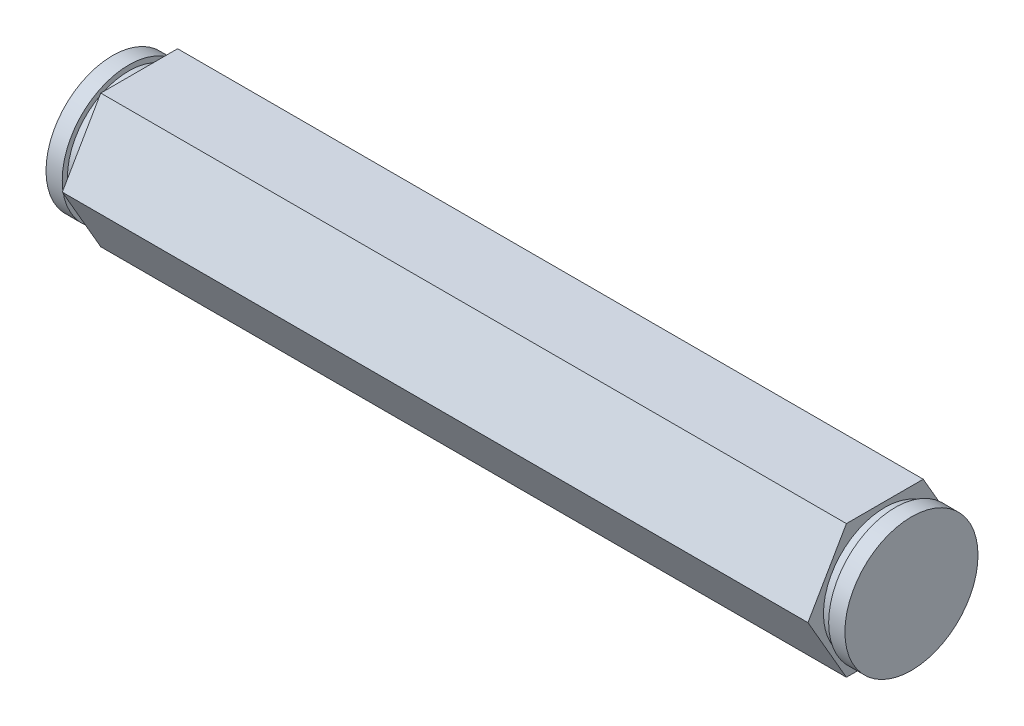
ISO-10303-21;
HEADER;
FILE_DESCRIPTION(('STEP AP214'),'2;1');
FILE_NAME('part.step','',(''),(''),'','','');
FILE_SCHEMA(('AUTOMOTIVE_DESIGN { 1 0 10303 214 1 1 1 1 }'));
ENDSEC;
DATA;
#1=APPLICATION_CONTEXT('core data for automotive mechanical design processes');
#2=APPLICATION_PROTOCOL_DEFINITION('international standard','automotive_design',2000,#1);
#3=PRODUCT_CONTEXT('',#1,'mechanical');
#4=PRODUCT('Part','Part','',(#3));
#5=PRODUCT_RELATED_PRODUCT_CATEGORY('part','',(#4));
#6=PRODUCT_DEFINITION_FORMATION('','',#4);
#7=PRODUCT_DEFINITION_CONTEXT('part definition',#1,'design');
#8=PRODUCT_DEFINITION('design','',#6,#7);
#9=PRODUCT_DEFINITION_SHAPE('','',#8);
#10=(LENGTH_UNIT() NAMED_UNIT(*) SI_UNIT(.MILLI.,.METRE.));
#11=(NAMED_UNIT(*) PLANE_ANGLE_UNIT() SI_UNIT($,.RADIAN.));
#12=(NAMED_UNIT(*) SI_UNIT($,.STERADIAN.) SOLID_ANGLE_UNIT());
#13=UNCERTAINTY_MEASURE_WITH_UNIT(LENGTH_MEASURE(1.E-05),#10,'distance_accuracy_value','');
#14=(GEOMETRIC_REPRESENTATION_CONTEXT(3) GLOBAL_UNCERTAINTY_ASSIGNED_CONTEXT((#13)) GLOBAL_UNIT_ASSIGNED_CONTEXT((#10,
#11,#12)) REPRESENTATION_CONTEXT('',''));
#15=CARTESIAN_POINT('',(0.,0.,0.));
#16=DIRECTION('',(0.,0.,1.));
#17=DIRECTION('',(1.,0.,0.));
#18=AXIS2_PLACEMENT_3D('',#15,#16,#17);
#19=CARTESIAN_POINT('',(38.11087501,-6.34999999999993,-3.66617420935418));
#20=DIRECTION('',(0.,0.499999999999995,0.866025403784441));
#21=DIRECTION('',(0.,-0.866025403784441,0.499999999999995));
#22=AXIS2_PLACEMENT_3D('',#19,#20,#21);
#23=PLANE('',#22);
#24=DIRECTION('',(-1.,0.,0.));
#25=VECTOR('',#24,1.);
#26=CARTESIAN_POINT('',(38.11087501,-6.34999999999993,-3.66617420935418));
#27=LINE('',#26,#25);
#28=CARTESIAN_POINT('',(35.57087501,-6.34999999999993,-3.66617420935418));
#29=VERTEX_POINT('',#28);
#30=CARTESIAN_POINT('',(-35.57087501,-6.34999999999993,-3.66617420935418));
#31=VERTEX_POINT('',#30);
#32=EDGE_CURVE('E114',#29,#31,#27,.T.);
#33=ORIENTED_EDGE('',*,*,#32,.T.);
#34=DIRECTION('',(0.,0.866025403784441,-0.499999999999995));
#35=VECTOR('',#34,1.);
#36=CARTESIAN_POINT('',(-35.57087501,-6.34999999999993,-3.66617420935418));
#37=LINE('',#36,#35);
#38=CARTESIAN_POINT('',(-35.57087501,0.,-7.33234841870821));
#39=VERTEX_POINT('',#38);
#40=EDGE_CURVE('E58',#31,#39,#37,.T.);
#41=ORIENTED_EDGE('',*,*,#40,.T.);
#42=DIRECTION('',(-1.,0.,0.));
#43=VECTOR('',#42,1.);
#44=CARTESIAN_POINT('',(38.11087501,0.,-7.33234841870821));
#45=LINE('',#44,#43);
#46=CARTESIAN_POINT('',(35.57087501,0.,-7.33234841870821));
#47=VERTEX_POINT('',#46);
#48=EDGE_CURVE('E131',#47,#39,#45,.T.);
#49=ORIENTED_EDGE('',*,*,#48,.F.);
#50=DIRECTION('',(0.,-0.866025403784441,0.499999999999995));
#51=VECTOR('',#50,1.);
#52=CARTESIAN_POINT('',(35.57087501,-6.34999999999993,-3.66617420935418));
#53=LINE('',#52,#51);
#54=EDGE_CURVE('E120',#47,#29,#53,.T.);
#55=ORIENTED_EDGE('',*,*,#54,.T.);
#56=EDGE_LOOP('',(#33,#41,#49,#55));
#57=FACE_BOUND('',#56,.T.);
#58=ADVANCED_FACE('F43',(#57),#23,.F.);
#59=CARTESIAN_POINT('',(38.11087501,0.,-7.33234841870821));
#60=DIRECTION('',(0.,-0.500000000000001,0.866025403784438));
#61=DIRECTION('',(0.,-0.866025403784438,-0.500000000000001));
#62=AXIS2_PLACEMENT_3D('',#59,#60,#61);
#63=PLANE('',#62);
#64=ORIENTED_EDGE('',*,*,#48,.T.);
#65=DIRECTION('',(0.,0.866025403784438,0.500000000000001));
#66=VECTOR('',#65,1.);
#67=CARTESIAN_POINT('',(-35.57087501,0.,-7.33234841870821));
#68=LINE('',#67,#66);
#69=CARTESIAN_POINT('',(-35.57087501,6.34999999999998,-3.66617420935409));
#70=VERTEX_POINT('',#69);
#71=EDGE_CURVE('E171',#39,#70,#68,.T.);
#72=ORIENTED_EDGE('',*,*,#71,.T.);
#73=DIRECTION('',(-1.,0.,0.));
#74=VECTOR('',#73,1.);
#75=CARTESIAN_POINT('',(38.11087501,6.34999999999998,-3.66617420935409));
#76=LINE('',#75,#74);
#77=CARTESIAN_POINT('',(35.57087501,6.34999999999998,-3.66617420935409));
#78=VERTEX_POINT('',#77);
#79=EDGE_CURVE('E127',#78,#70,#76,.T.);
#80=ORIENTED_EDGE('',*,*,#79,.F.);
#81=DIRECTION('',(0.,-0.866025403784438,-0.500000000000001));
#82=VECTOR('',#81,1.);
#83=CARTESIAN_POINT('',(35.57087501,0.,-7.33234841870821));
#84=LINE('',#83,#82);
#85=EDGE_CURVE('E199',#78,#47,#84,.T.);
#86=ORIENTED_EDGE('',*,*,#85,.T.);
#87=EDGE_LOOP('',(#64,#72,#80,#86));
#88=FACE_BOUND('',#87,.T.);
#89=ADVANCED_FACE('F209',(#88),#63,.F.);
#90=CARTESIAN_POINT('',(38.11087501,6.34999999999998,-3.66617420935409));
#91=DIRECTION('',(0.,-1.,0.));
#92=DIRECTION('',(0.,0.,-1.));
#93=AXIS2_PLACEMENT_3D('',#90,#91,#92);
#94=PLANE('',#93);
#95=ORIENTED_EDGE('',*,*,#79,.T.);
#96=DIRECTION('',(0.,0.,1.));
#97=VECTOR('',#96,1.);
#98=CARTESIAN_POINT('',(-35.57087501,6.34999999999998,-3.66617420935409));
#99=LINE('',#98,#97);
#100=CARTESIAN_POINT('',(-35.57087501,6.34999999999995,3.66617420935414));
#101=VERTEX_POINT('',#100);
#102=EDGE_CURVE('E167',#70,#101,#99,.T.);
#103=ORIENTED_EDGE('',*,*,#102,.T.);
#104=DIRECTION('',(-1.,0.,0.));
#105=VECTOR('',#104,1.);
#106=CARTESIAN_POINT('',(38.11087501,6.34999999999995,3.66617420935414));
#107=LINE('',#106,#105);
#108=CARTESIAN_POINT('',(35.57087501,6.34999999999995,3.66617420935414));
#109=VERTEX_POINT('',#108);
#110=EDGE_CURVE('E118',#109,#101,#107,.T.);
#111=ORIENTED_EDGE('',*,*,#110,.F.);
#112=DIRECTION('',(0.,0.,-1.));
#113=VECTOR('',#112,1.);
#114=CARTESIAN_POINT('',(35.57087501,6.34999999999998,-3.66617420935409));
#115=LINE('',#114,#113);
#116=EDGE_CURVE('E195',#109,#78,#115,.T.);
#117=ORIENTED_EDGE('',*,*,#116,.T.);
#118=EDGE_LOOP('',(#95,#103,#111,#117));
#119=FACE_BOUND('',#118,.T.);
#120=ADVANCED_FACE('F211',(#119),#94,.F.);
#121=CARTESIAN_POINT('',(38.11087501,6.34999999999995,3.66617420935414));
#122=DIRECTION('',(0.,-0.499999999999995,-0.866025403784442));
#123=DIRECTION('',(0.,0.866025403784442,-0.499999999999995));
#124=AXIS2_PLACEMENT_3D('',#121,#122,#123);
#125=PLANE('',#124);
#126=ORIENTED_EDGE('',*,*,#110,.T.);
#127=DIRECTION('',(0.,-0.866025403784442,0.499999999999995));
#128=VECTOR('',#127,1.);
#129=CARTESIAN_POINT('',(-35.57087501,6.34999999999995,3.66617420935414));
#130=LINE('',#129,#128);
#131=CARTESIAN_POINT('',(-35.57087501,0.,7.33234841870821));
#132=VERTEX_POINT('',#131);
#133=EDGE_CURVE('E108',#101,#132,#130,.T.);
#134=ORIENTED_EDGE('',*,*,#133,.T.);
#135=DIRECTION('',(-1.,0.,0.));
#136=VECTOR('',#135,1.);
#137=CARTESIAN_POINT('',(38.11087501,0.,7.33234841870821));
#138=LINE('',#137,#136);
#139=CARTESIAN_POINT('',(35.57087501,0.,7.33234841870821));
#140=VERTEX_POINT('',#139);
#141=EDGE_CURVE('E106',#140,#132,#138,.T.);
#142=ORIENTED_EDGE('',*,*,#141,.F.);
#143=DIRECTION('',(0.,0.866025403784442,-0.499999999999995));
#144=VECTOR('',#143,1.);
#145=CARTESIAN_POINT('',(35.57087501,6.34999999999995,3.66617420935414));
#146=LINE('',#145,#144);
#147=EDGE_CURVE('E191',#140,#109,#146,.T.);
#148=ORIENTED_EDGE('',*,*,#147,.T.);
#149=EDGE_LOOP('',(#126,#134,#142,#148));
#150=FACE_BOUND('',#149,.T.);
#151=ADVANCED_FACE('F214',(#150),#125,.F.);
#152=CARTESIAN_POINT('',(38.11087501,0.,7.33234841870821));
#153=DIRECTION('',(0.,0.500000000000007,-0.866025403784435));
#154=DIRECTION('',(0.,0.866025403784435,0.500000000000007));
#155=AXIS2_PLACEMENT_3D('',#152,#153,#154);
#156=PLANE('',#155);
#157=ORIENTED_EDGE('',*,*,#141,.T.);
#158=DIRECTION('',(0.,-0.866025403784435,-0.500000000000007));
#159=VECTOR('',#158,1.);
#160=CARTESIAN_POINT('',(-35.57087501,0.,7.33234841870821));
#161=LINE('',#160,#159);
#162=CARTESIAN_POINT('',(-35.57087501,-6.35,3.66617420935405));
#163=VERTEX_POINT('',#162);
#164=EDGE_CURVE('E94',#132,#163,#161,.T.);
#165=ORIENTED_EDGE('',*,*,#164,.T.);
#166=DIRECTION('',(-1.,0.,0.));
#167=VECTOR('',#166,1.);
#168=CARTESIAN_POINT('',(38.11087501,-6.35,3.66617420935405));
#169=LINE('',#168,#167);
#170=CARTESIAN_POINT('',(35.57087501,-6.35,3.66617420935405));
#171=VERTEX_POINT('',#170);
#172=EDGE_CURVE('E104',#171,#163,#169,.T.);
#173=ORIENTED_EDGE('',*,*,#172,.F.);
#174=DIRECTION('',(0.,0.866025403784435,0.500000000000007));
#175=VECTOR('',#174,1.);
#176=CARTESIAN_POINT('',(35.57087501,0.,7.33234841870821));
#177=LINE('',#176,#175);
#178=EDGE_CURVE('E65',#171,#140,#177,.T.);
#179=ORIENTED_EDGE('',*,*,#178,.T.);
#180=EDGE_LOOP('',(#157,#165,#173,#179));
#181=FACE_BOUND('',#180,.T.);
#182=ADVANCED_FACE('F103',(#181),#156,.F.);
#183=CARTESIAN_POINT('',(38.11087501,-6.35,3.66617420935405));
#184=DIRECTION('',(0.,1.,0.));
#185=DIRECTION('',(0.,0.,1.));
#186=AXIS2_PLACEMENT_3D('',#183,#184,#185);
#187=PLANE('',#186);
#188=ORIENTED_EDGE('',*,*,#172,.T.);
#189=DIRECTION('',(0.,0.,-1.));
#190=VECTOR('',#189,1.);
#191=CARTESIAN_POINT('',(-35.57087501,-6.35,3.66617420935405));
#192=LINE('',#191,#190);
#193=EDGE_CURVE('E11',#163,#31,#192,.T.);
#194=ORIENTED_EDGE('',*,*,#193,.T.);
#195=ORIENTED_EDGE('',*,*,#32,.F.);
#196=DIRECTION('',(0.,0.,1.));
#197=VECTOR('',#196,1.);
#198=CARTESIAN_POINT('',(35.57087501,-6.35,3.66617420935405));
#199=LINE('',#198,#197);
#200=EDGE_CURVE('E112',#29,#171,#199,.T.);
#201=ORIENTED_EDGE('',*,*,#200,.T.);
#202=EDGE_LOOP('',(#188,#194,#195,#201));
#203=FACE_BOUND('',#202,.T.);
#204=ADVANCED_FACE('F111',(#203),#187,.F.);
#205=CARTESIAN_POINT('',(35.57087501,0.,8.89));
#206=DIRECTION('',(-1.,0.,0.));
#207=DIRECTION('',(0.,0.,1.));
#208=AXIS2_PLACEMENT_3D('',#205,#206,#207);
#209=PLANE('',#208);
#210=CARTESIAN_POINT('',(35.57087501,0.,0.));
#211=DIRECTION('',(-1.,0.,0.));
#212=DIRECTION('',(0.,0.,1.));
#213=AXIS2_PLACEMENT_3D('',#210,#211,#212);
#214=CIRCLE('',#213,5.8547);
#215=CARTESIAN_POINT('',(35.57087501,0.,5.8547));
#216=VERTEX_POINT('',#215);
#217=EDGE_CURVE('E185',#216,#216,#214,.T.);
#218=ORIENTED_EDGE('',*,*,#217,.T.);
#219=EDGE_LOOP('',(#218));
#220=FACE_BOUND('',#219,.T.);
#221=ORIENTED_EDGE('',*,*,#85,.F.);
#222=ORIENTED_EDGE('',*,*,#116,.F.);
#223=ORIENTED_EDGE('',*,*,#147,.F.);
#224=ORIENTED_EDGE('',*,*,#178,.F.);
#225=ORIENTED_EDGE('',*,*,#200,.F.);
#226=ORIENTED_EDGE('',*,*,#54,.F.);
#227=EDGE_LOOP('',(#221,#222,#223,#224,#225,#226));
#228=FACE_BOUND('',#227,.T.);
#229=ADVANCED_FACE('F206',(#220,#228),#209,.F.);
#230=CARTESIAN_POINT('',(0.,0.,0.));
#231=DIRECTION('',(-1.,0.,0.));
#232=DIRECTION('',(0.,0.,1.));
#233=AXIS2_PLACEMENT_3D('',#230,#231,#232);
#234=CYLINDRICAL_SURFACE('',#233,6.35);
#235=CARTESIAN_POINT('',(38.11087501,0.,0.));
#236=DIRECTION('',(1.,0.,0.));
#237=DIRECTION('',(0.,0.,-1.));
#238=AXIS2_PLACEMENT_3D('',#235,#236,#237);
#239=CIRCLE('',#238,6.35);
#240=CARTESIAN_POINT('',(38.11087501,0.,-6.35));
#241=VERTEX_POINT('',#240);
#242=EDGE_CURVE('E135',#241,#241,#239,.F.);
#243=ORIENTED_EDGE('',*,*,#242,.T.);
#244=EDGE_LOOP('',(#243));
#245=FACE_BOUND('',#244,.T.);
#246=CARTESIAN_POINT('',(36.56147501,0.,0.));
#247=DIRECTION('',(-1.,0.,0.));
#248=DIRECTION('',(0.,0.,1.));
#249=AXIS2_PLACEMENT_3D('',#246,#247,#248);
#250=CIRCLE('',#249,6.35);
#251=CARTESIAN_POINT('',(36.56147501,0.,6.35));
#252=VERTEX_POINT('',#251);
#253=EDGE_CURVE('E177',#252,#252,#250,.T.);
#254=ORIENTED_EDGE('',*,*,#253,.F.);
#255=EDGE_LOOP('',(#254));
#256=FACE_BOUND('',#255,.T.);
#257=ADVANCED_FACE('F331',(#245,#256),#234,.T.);
#258=CARTESIAN_POINT('',(0.,0.,0.));
#259=DIRECTION('',(-1.,0.,0.));
#260=DIRECTION('',(0.,0.,1.));
#261=AXIS2_PLACEMENT_3D('',#258,#259,#260);
#262=CYLINDRICAL_SURFACE('',#261,5.8547);
#263=ORIENTED_EDGE('',*,*,#217,.F.);
#264=EDGE_LOOP('',(#263));
#265=FACE_BOUND('',#264,.T.);
#266=CARTESIAN_POINT('',(36.56147501,0.,0.));
#267=DIRECTION('',(-1.,0.,0.));
#268=DIRECTION('',(0.,0.,1.));
#269=AXIS2_PLACEMENT_3D('',#266,#267,#268);
#270=CIRCLE('',#269,5.8547);
#271=CARTESIAN_POINT('',(36.56147501,0.,5.8547));
#272=VERTEX_POINT('',#271);
#273=EDGE_CURVE('E181',#272,#272,#270,.T.);
#274=ORIENTED_EDGE('',*,*,#273,.T.);
#275=EDGE_LOOP('',(#274));
#276=FACE_BOUND('',#275,.T.);
#277=ADVANCED_FACE('F319',(#265,#276),#262,.T.);
#278=CARTESIAN_POINT('',(36.56147501,0.,5.8547));
#279=DIRECTION('',(1.,0.,0.));
#280=DIRECTION('',(0.,0.,-1.));
#281=AXIS2_PLACEMENT_3D('',#278,#279,#280);
#282=PLANE('',#281);
#283=ORIENTED_EDGE('',*,*,#273,.F.);
#284=EDGE_LOOP('',(#283));
#285=FACE_BOUND('',#284,.T.);
#286=ORIENTED_EDGE('',*,*,#253,.T.);
#287=EDGE_LOOP('',(#286));
#288=FACE_BOUND('',#287,.T.);
#289=ADVANCED_FACE('F313',(#285,#288),#282,.F.);
#290=CARTESIAN_POINT('',(38.11087501,0.,0.));
#291=DIRECTION('',(1.,0.,0.));
#292=DIRECTION('',(0.,0.,-1.));
#293=AXIS2_PLACEMENT_3D('',#290,#291,#292);
#294=PLANE('',#293);
#295=ORIENTED_EDGE('',*,*,#242,.F.);
#296=EDGE_LOOP('',(#295));
#297=FACE_BOUND('',#296,.T.);
#298=ADVANCED_FACE('F266',(#297),#294,.T.);
#299=CARTESIAN_POINT('',(-35.57087501,0.,8.89));
#300=DIRECTION('',(1.,0.,0.));
#301=DIRECTION('',(0.,0.,1.));
#302=AXIS2_PLACEMENT_3D('',#299,#300,#301);
#303=PLANE('',#302);
#304=CARTESIAN_POINT('',(-35.57087501,0.,0.));
#305=DIRECTION('',(-1.,0.,0.));
#306=DIRECTION('',(0.,0.,1.));
#307=AXIS2_PLACEMENT_3D('',#304,#305,#306);
#308=CIRCLE('',#307,5.8547);
#309=CARTESIAN_POINT('',(-35.57087501,0.,5.8547));
#310=VERTEX_POINT('',#309);
#311=EDGE_CURVE('E109',#310,#310,#308,.T.);
#312=ORIENTED_EDGE('',*,*,#311,.F.);
#313=EDGE_LOOP('',(#312));
#314=FACE_BOUND('',#313,.T.);
#315=ORIENTED_EDGE('',*,*,#193,.F.);
#316=ORIENTED_EDGE('',*,*,#164,.F.);
#317=ORIENTED_EDGE('',*,*,#133,.F.);
#318=ORIENTED_EDGE('',*,*,#102,.F.);
#319=ORIENTED_EDGE('',*,*,#71,.F.);
#320=ORIENTED_EDGE('',*,*,#40,.F.);
#321=EDGE_LOOP('',(#315,#316,#317,#318,#319,#320));
#322=FACE_BOUND('',#321,.T.);
#323=ADVANCED_FACE('F93',(#314,#322),#303,.F.);
#324=CARTESIAN_POINT('',(0.,0.,0.));
#325=DIRECTION('',(1.,0.,0.));
#326=DIRECTION('',(0.,0.,1.));
#327=AXIS2_PLACEMENT_3D('',#324,#325,#326);
#328=CYLINDRICAL_SURFACE('',#327,6.35);
#329=CARTESIAN_POINT('',(-38.11087501,0.,0.));
#330=DIRECTION('',(1.,0.,0.));
#331=DIRECTION('',(0.,0.,-1.));
#332=AXIS2_PLACEMENT_3D('',#329,#330,#331);
#333=CIRCLE('',#332,6.35);
#334=CARTESIAN_POINT('',(-38.11087501,0.,-6.35));
#335=VERTEX_POINT('',#334);
#336=EDGE_CURVE('E51',#335,#335,#333,.F.);
#337=ORIENTED_EDGE('',*,*,#336,.F.);
#338=EDGE_LOOP('',(#337));
#339=FACE_BOUND('',#338,.T.);
#340=CARTESIAN_POINT('',(-36.56147501,0.,0.));
#341=DIRECTION('',(-1.,0.,0.));
#342=DIRECTION('',(0.,0.,1.));
#343=AXIS2_PLACEMENT_3D('',#340,#341,#342);
#344=CIRCLE('',#343,6.35);
#345=CARTESIAN_POINT('',(-36.56147501,0.,6.35));
#346=VERTEX_POINT('',#345);
#347=EDGE_CURVE('E153',#346,#346,#344,.T.);
#348=ORIENTED_EDGE('',*,*,#347,.T.);
#349=EDGE_LOOP('',(#348));
#350=FACE_BOUND('',#349,.T.);
#351=ADVANCED_FACE('F146',(#339,#350),#328,.T.);
#352=CARTESIAN_POINT('',(0.,0.,0.));
#353=DIRECTION('',(1.,0.,0.));
#354=DIRECTION('',(0.,0.,1.));
#355=AXIS2_PLACEMENT_3D('',#352,#353,#354);
#356=CYLINDRICAL_SURFACE('',#355,5.8547);
#357=ORIENTED_EDGE('',*,*,#311,.T.);
#358=EDGE_LOOP('',(#357));
#359=FACE_BOUND('',#358,.T.);
#360=CARTESIAN_POINT('',(-36.56147501,0.,0.));
#361=DIRECTION('',(-1.,0.,0.));
#362=DIRECTION('',(0.,0.,1.));
#363=AXIS2_PLACEMENT_3D('',#360,#361,#362);
#364=CIRCLE('',#363,5.8547);
#365=CARTESIAN_POINT('',(-36.56147501,0.,5.8547));
#366=VERTEX_POINT('',#365);
#367=EDGE_CURVE('E156',#366,#366,#364,.T.);
#368=ORIENTED_EDGE('',*,*,#367,.F.);
#369=EDGE_LOOP('',(#368));
#370=FACE_BOUND('',#369,.T.);
#371=ADVANCED_FACE('F149',(#359,#370),#356,.T.);
#372=CARTESIAN_POINT('',(-36.56147501,0.,5.8547));
#373=DIRECTION('',(-1.,0.,0.));
#374=DIRECTION('',(0.,0.,-1.));
#375=AXIS2_PLACEMENT_3D('',#372,#373,#374);
#376=PLANE('',#375);
#377=ORIENTED_EDGE('',*,*,#367,.T.);
#378=EDGE_LOOP('',(#377));
#379=FACE_BOUND('',#378,.T.);
#380=ORIENTED_EDGE('',*,*,#347,.F.);
#381=EDGE_LOOP('',(#380));
#382=FACE_BOUND('',#381,.T.);
#383=ADVANCED_FACE('F286',(#379,#382),#376,.F.);
#384=CARTESIAN_POINT('',(-38.11087501,0.,0.));
#385=DIRECTION('',(1.,0.,0.));
#386=DIRECTION('',(0.,0.,-1.));
#387=AXIS2_PLACEMENT_3D('',#384,#385,#386);
#388=PLANE('',#387);
#389=ORIENTED_EDGE('',*,*,#336,.T.);
#390=EDGE_LOOP('',(#389));
#391=FACE_BOUND('',#390,.T.);
#392=ADVANCED_FACE('F144',(#391),#388,.F.);
#393=CLOSED_SHELL('',(#58,#89,#120,#151,#182,#204,#229,#257,#277,#289,#298,#323,#351,#371,#383,#392));
#394=MANIFOLD_SOLID_BREP('B2',#393);
#395=ADVANCED_BREP_SHAPE_REPRESENTATION('',(#18,#394),#14);
#396=SHAPE_DEFINITION_REPRESENTATION(#9,#395);
ENDSEC;
END-ISO-10303-21;
